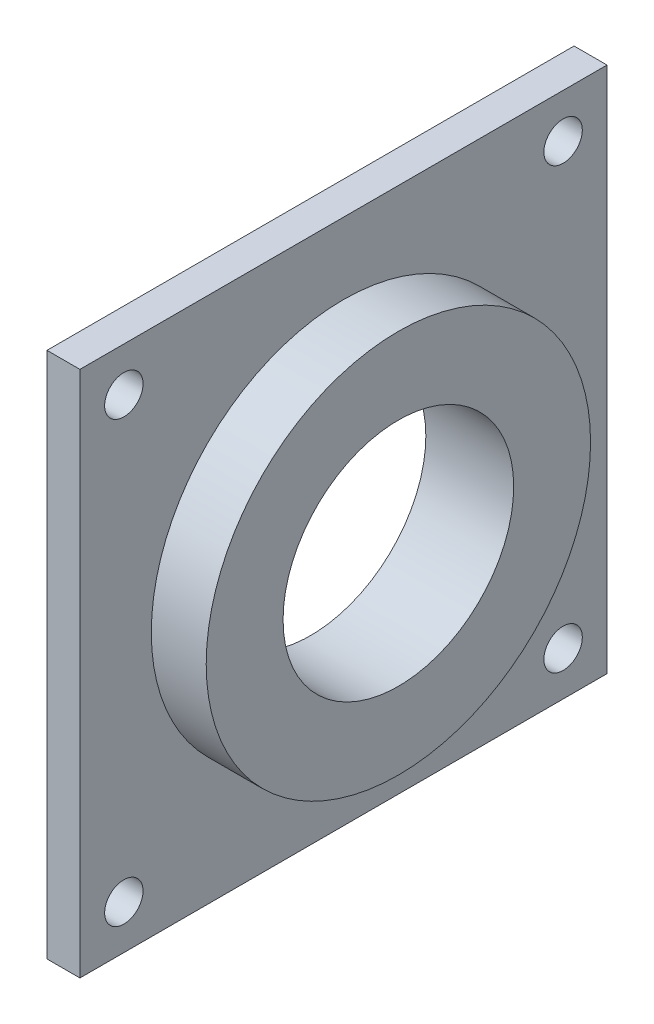
ISO-10303-21;
HEADER;
FILE_DESCRIPTION(('STEP AP214'),'2;1');
FILE_NAME('part.step','',(''),(''),'','','');
FILE_SCHEMA(('AUTOMOTIVE_DESIGN { 1 0 10303 214 1 1 1 1 }'));
ENDSEC;
DATA;
#1=APPLICATION_CONTEXT('core data for automotive mechanical design processes');
#2=APPLICATION_PROTOCOL_DEFINITION('international standard','automotive_design',2000,#1);
#3=PRODUCT_CONTEXT('',#1,'mechanical');
#4=PRODUCT('Part','Part','',(#3));
#5=PRODUCT_RELATED_PRODUCT_CATEGORY('part','',(#4));
#6=PRODUCT_DEFINITION_FORMATION('','',#4);
#7=PRODUCT_DEFINITION_CONTEXT('part definition',#1,'design');
#8=PRODUCT_DEFINITION('design','',#6,#7);
#9=PRODUCT_DEFINITION_SHAPE('','',#8);
#10=(LENGTH_UNIT() NAMED_UNIT(*) SI_UNIT(.MILLI.,.METRE.));
#11=(NAMED_UNIT(*) PLANE_ANGLE_UNIT() SI_UNIT($,.RADIAN.));
#12=(NAMED_UNIT(*) SI_UNIT($,.STERADIAN.) SOLID_ANGLE_UNIT());
#13=UNCERTAINTY_MEASURE_WITH_UNIT(LENGTH_MEASURE(1.E-05),#10,'distance_accuracy_value','');
#14=(GEOMETRIC_REPRESENTATION_CONTEXT(3) GLOBAL_UNCERTAINTY_ASSIGNED_CONTEXT((#13)) GLOBAL_UNIT_ASSIGNED_CONTEXT((#10,
#11,#12)) REPRESENTATION_CONTEXT('',''));
#15=CARTESIAN_POINT('',(0.,0.,0.));
#16=DIRECTION('',(0.,0.,1.));
#17=DIRECTION('',(1.,0.,0.));
#18=AXIS2_PLACEMENT_3D('',#15,#16,#17);
#19=CARTESIAN_POINT('',(3.0073,24.,24.));
#20=DIRECTION('',(1.,0.,0.));
#21=DIRECTION('',(0.,0.,-1.));
#22=AXIS2_PLACEMENT_3D('',#19,#20,#21);
#23=CYLINDRICAL_SURFACE('',#22,17.5);
#24=CARTESIAN_POINT('',(3.0073,24.,24.));
#25=DIRECTION('',(1.,0.,0.));
#26=DIRECTION('',(0.,0.,-1.));
#27=AXIS2_PLACEMENT_3D('',#24,#25,#26);
#28=CIRCLE('',#27,17.5);
#29=CARTESIAN_POINT('',(3.0073,24.,6.5));
#30=VERTEX_POINT('',#29);
#31=EDGE_CURVE('E65',#30,#30,#28,.F.);
#32=ORIENTED_EDGE('',*,*,#31,.F.);
#33=EDGE_LOOP('',(#32));
#34=FACE_BOUND('',#33,.T.);
#35=CARTESIAN_POINT('',(8.0073,24.,24.));
#36=DIRECTION('',(1.,0.,0.));
#37=DIRECTION('',(0.,0.,-1.));
#38=AXIS2_PLACEMENT_3D('',#35,#36,#37);
#39=CIRCLE('',#38,17.5);
#40=CARTESIAN_POINT('',(8.0073,24.,6.5));
#41=VERTEX_POINT('',#40);
#42=EDGE_CURVE('E18',#41,#41,#39,.T.);
#43=ORIENTED_EDGE('',*,*,#42,.F.);
#44=EDGE_LOOP('',(#43));
#45=FACE_BOUND('',#44,.T.);
#46=ADVANCED_FACE('F15',(#34,#45),#23,.T.);
#47=CARTESIAN_POINT('',(8.0073,24.,24.));
#48=DIRECTION('',(1.,0.,0.));
#49=DIRECTION('',(0.,0.,-1.));
#50=AXIS2_PLACEMENT_3D('',#47,#48,#49);
#51=PLANE('',#50);
#52=CARTESIAN_POINT('',(8.0073,24.,24.));
#53=DIRECTION('',(1.,0.,0.));
#54=DIRECTION('',(0.,0.,-1.));
#55=AXIS2_PLACEMENT_3D('',#52,#53,#54);
#56=CIRCLE('',#55,10.5);
#57=CARTESIAN_POINT('',(8.0073,24.,13.5));
#58=VERTEX_POINT('',#57);
#59=EDGE_CURVE('E95',#58,#58,#56,.F.);
#60=ORIENTED_EDGE('',*,*,#59,.T.);
#61=EDGE_LOOP('',(#60));
#62=FACE_BOUND('',#61,.T.);
#63=ORIENTED_EDGE('',*,*,#42,.T.);
#64=EDGE_LOOP('',(#63));
#65=FACE_BOUND('',#64,.T.);
#66=ADVANCED_FACE('F112',(#62,#65),#51,.T.);
#67=CARTESIAN_POINT('',(3.0073,0.,0.));
#68=DIRECTION('',(1.,0.,0.));
#69=DIRECTION('',(0.,0.,-1.));
#70=AXIS2_PLACEMENT_3D('',#67,#68,#69);
#71=PLANE('',#70);
#72=CARTESIAN_POINT('',(3.0073,4.,44.));
#73=DIRECTION('',(1.,0.,0.));
#74=DIRECTION('',(0.,0.,-1.));
#75=AXIS2_PLACEMENT_3D('',#72,#73,#74);
#76=CIRCLE('',#75,1.75);
#77=CARTESIAN_POINT('',(3.0073,4.,42.25));
#78=VERTEX_POINT('',#77);
#79=EDGE_CURVE('E92',#78,#78,#76,.F.);
#80=ORIENTED_EDGE('',*,*,#79,.T.);
#81=EDGE_LOOP('',(#80));
#82=FACE_BOUND('',#81,.T.);
#83=ORIENTED_EDGE('',*,*,#31,.T.);
#84=EDGE_LOOP('',(#83));
#85=FACE_BOUND('',#84,.T.);
#86=CARTESIAN_POINT('',(3.0073,4.,4.));
#87=DIRECTION('',(1.,0.,0.));
#88=DIRECTION('',(0.,0.,-1.));
#89=AXIS2_PLACEMENT_3D('',#86,#87,#88);
#90=CIRCLE('',#89,1.75);
#91=CARTESIAN_POINT('',(3.0073,4.,2.25));
#92=VERTEX_POINT('',#91);
#93=EDGE_CURVE('E98',#92,#92,#90,.F.);
#94=ORIENTED_EDGE('',*,*,#93,.T.);
#95=EDGE_LOOP('',(#94));
#96=FACE_BOUND('',#95,.T.);
#97=CARTESIAN_POINT('',(3.0073,44.,44.));
#98=DIRECTION('',(1.,0.,0.));
#99=DIRECTION('',(0.,0.,-1.));
#100=AXIS2_PLACEMENT_3D('',#97,#98,#99);
#101=CIRCLE('',#100,1.75);
#102=CARTESIAN_POINT('',(3.0073,44.,42.25));
#103=VERTEX_POINT('',#102);
#104=EDGE_CURVE('E101',#103,#103,#101,.F.);
#105=ORIENTED_EDGE('',*,*,#104,.T.);
#106=EDGE_LOOP('',(#105));
#107=FACE_BOUND('',#106,.T.);
#108=CARTESIAN_POINT('',(3.0073,44.,4.));
#109=DIRECTION('',(1.,0.,0.));
#110=DIRECTION('',(0.,0.,-1.));
#111=AXIS2_PLACEMENT_3D('',#108,#109,#110);
#112=CIRCLE('',#111,1.75);
#113=CARTESIAN_POINT('',(3.0073,44.,2.25));
#114=VERTEX_POINT('',#113);
#115=EDGE_CURVE('E104',#114,#114,#112,.F.);
#116=ORIENTED_EDGE('',*,*,#115,.T.);
#117=EDGE_LOOP('',(#116));
#118=FACE_BOUND('',#117,.T.);
#119=DIRECTION('',(0.,0.,1.));
#120=VECTOR('',#119,1.);
#121=CARTESIAN_POINT('',(3.0073,48.,0.));
#122=LINE('',#121,#120);
#123=CARTESIAN_POINT('',(3.0073,48.,48.));
#124=VERTEX_POINT('',#123);
#125=CARTESIAN_POINT('',(3.0073,48.,0.));
#126=VERTEX_POINT('',#125);
#127=EDGE_CURVE('E256',#124,#126,#122,.F.);
#128=ORIENTED_EDGE('',*,*,#127,.F.);
#129=DIRECTION('',(0.,1.,0.));
#130=VECTOR('',#129,1.);
#131=CARTESIAN_POINT('',(3.0073,0.,48.));
#132=LINE('',#131,#130);
#133=CARTESIAN_POINT('',(3.0073,0.,48.));
#134=VERTEX_POINT('',#133);
#135=EDGE_CURVE('E59',#134,#124,#132,.T.);
#136=ORIENTED_EDGE('',*,*,#135,.F.);
#137=DIRECTION('',(0.,0.,1.));
#138=VECTOR('',#137,1.);
#139=CARTESIAN_POINT('',(3.0073,0.,0.));
#140=LINE('',#139,#138);
#141=CARTESIAN_POINT('',(3.0073,0.,0.));
#142=VERTEX_POINT('',#141);
#143=EDGE_CURVE('E57',#134,#142,#140,.F.);
#144=ORIENTED_EDGE('',*,*,#143,.T.);
#145=DIRECTION('',(0.,1.,0.));
#146=VECTOR('',#145,1.);
#147=CARTESIAN_POINT('',(3.0073,0.,0.));
#148=LINE('',#147,#146);
#149=EDGE_CURVE('E54',#142,#126,#148,.T.);
#150=ORIENTED_EDGE('',*,*,#149,.T.);
#151=EDGE_LOOP('',(#128,#136,#144,#150));
#152=FACE_BOUND('',#151,.T.);
#153=ADVANCED_FACE('F58',(#82,#85,#96,#107,#118,#152),#71,.T.);
#154=CARTESIAN_POINT('',(0.007300000000001,0.,0.));
#155=DIRECTION('',(0.,1.,0.));
#156=DIRECTION('',(0.,0.,1.));
#157=AXIS2_PLACEMENT_3D('',#154,#155,#156);
#158=PLANE('',#157);
#159=DIRECTION('',(1.,0.,0.));
#160=VECTOR('',#159,1.);
#161=CARTESIAN_POINT('',(0.007300000000001,0.,48.));
#162=LINE('',#161,#160);
#163=CARTESIAN_POINT('',(0.007300000000001,0.,48.));
#164=VERTEX_POINT('',#163);
#165=EDGE_CURVE('E260',#164,#134,#162,.T.);
#166=ORIENTED_EDGE('',*,*,#165,.F.);
#167=DIRECTION('',(0.,0.,-1.));
#168=VECTOR('',#167,1.);
#169=CARTESIAN_POINT('',(0.007300000000001,0.,0.));
#170=LINE('',#169,#168);
#171=CARTESIAN_POINT('',(0.007300000000001,0.,0.));
#172=VERTEX_POINT('',#171);
#173=EDGE_CURVE('E76',#164,#172,#170,.T.);
#174=ORIENTED_EDGE('',*,*,#173,.T.);
#175=DIRECTION('',(1.,0.,0.));
#176=VECTOR('',#175,1.);
#177=CARTESIAN_POINT('',(0.007300000000001,0.,0.));
#178=LINE('',#177,#176);
#179=EDGE_CURVE('E64',#172,#142,#178,.T.);
#180=ORIENTED_EDGE('',*,*,#179,.T.);
#181=ORIENTED_EDGE('',*,*,#143,.F.);
#182=EDGE_LOOP('',(#166,#174,#180,#181));
#183=FACE_BOUND('',#182,.T.);
#184=ADVANCED_FACE('F75',(#183),#158,.F.);
#185=CARTESIAN_POINT('',(0.007300000000001,0.,0.));
#186=DIRECTION('',(0.,0.,1.));
#187=DIRECTION('',(1.,0.,0.));
#188=AXIS2_PLACEMENT_3D('',#185,#186,#187);
#189=PLANE('',#188);
#190=ORIENTED_EDGE('',*,*,#149,.F.);
#191=ORIENTED_EDGE('',*,*,#179,.F.);
#192=DIRECTION('',(0.,1.,0.));
#193=VECTOR('',#192,1.);
#194=CARTESIAN_POINT('',(0.007300000000001,0.,0.));
#195=LINE('',#194,#193);
#196=CARTESIAN_POINT('',(0.007300000000001,48.,0.));
#197=VERTEX_POINT('',#196);
#198=EDGE_CURVE('E267',#172,#197,#195,.T.);
#199=ORIENTED_EDGE('',*,*,#198,.T.);
#200=DIRECTION('',(1.,0.,0.));
#201=VECTOR('',#200,1.);
#202=CARTESIAN_POINT('',(0.007300000000001,48.,0.));
#203=LINE('',#202,#201);
#204=EDGE_CURVE('E72',#126,#197,#203,.F.);
#205=ORIENTED_EDGE('',*,*,#204,.F.);
#206=EDGE_LOOP('',(#190,#191,#199,#205));
#207=FACE_BOUND('',#206,.T.);
#208=ADVANCED_FACE('F69',(#207),#189,.F.);
#209=CARTESIAN_POINT('',(0.007300000000001,48.,0.));
#210=DIRECTION('',(0.,1.,0.));
#211=DIRECTION('',(0.,0.,1.));
#212=AXIS2_PLACEMENT_3D('',#209,#210,#211);
#213=PLANE('',#212);
#214=DIRECTION('',(1.,0.,0.));
#215=VECTOR('',#214,1.);
#216=CARTESIAN_POINT('',(0.007300000000001,48.,48.));
#217=LINE('',#216,#215);
#218=CARTESIAN_POINT('',(0.007300000000001,48.,48.));
#219=VERTEX_POINT('',#218);
#220=EDGE_CURVE('E33',#124,#219,#217,.F.);
#221=ORIENTED_EDGE('',*,*,#220,.F.);
#222=ORIENTED_EDGE('',*,*,#127,.T.);
#223=ORIENTED_EDGE('',*,*,#204,.T.);
#224=DIRECTION('',(0.,0.,-1.));
#225=VECTOR('',#224,1.);
#226=CARTESIAN_POINT('',(0.007300000000001,48.,0.));
#227=LINE('',#226,#225);
#228=EDGE_CURVE('E258',#197,#219,#227,.F.);
#229=ORIENTED_EDGE('',*,*,#228,.T.);
#230=EDGE_LOOP('',(#221,#222,#223,#229));
#231=FACE_BOUND('',#230,.T.);
#232=ADVANCED_FACE('F153',(#231),#213,.T.);
#233=CARTESIAN_POINT('',(0.007300000000001,0.,48.));
#234=DIRECTION('',(0.,0.,1.));
#235=DIRECTION('',(1.,0.,0.));
#236=AXIS2_PLACEMENT_3D('',#233,#234,#235);
#237=PLANE('',#236);
#238=ORIENTED_EDGE('',*,*,#135,.T.);
#239=ORIENTED_EDGE('',*,*,#220,.T.);
#240=DIRECTION('',(0.,1.,0.));
#241=VECTOR('',#240,1.);
#242=CARTESIAN_POINT('',(0.007300000000001,0.,48.));
#243=LINE('',#242,#241);
#244=EDGE_CURVE('E91',#219,#164,#243,.F.);
#245=ORIENTED_EDGE('',*,*,#244,.T.);
#246=ORIENTED_EDGE('',*,*,#165,.T.);
#247=EDGE_LOOP('',(#238,#239,#245,#246));
#248=FACE_BOUND('',#247,.T.);
#249=ADVANCED_FACE('F149',(#248),#237,.T.);
#250=CARTESIAN_POINT('',(0.007300000000001,44.,4.));
#251=DIRECTION('',(1.,0.,0.));
#252=DIRECTION('',(0.,0.,-1.));
#253=AXIS2_PLACEMENT_3D('',#250,#251,#252);
#254=CYLINDRICAL_SURFACE('',#253,1.75);
#255=CARTESIAN_POINT('',(0.007300000000001,44.,4.));
#256=DIRECTION('',(1.,0.,0.));
#257=DIRECTION('',(0.,0.,-1.));
#258=AXIS2_PLACEMENT_3D('',#255,#256,#257);
#259=CIRCLE('',#258,1.75);
#260=CARTESIAN_POINT('',(0.007300000000001,44.,2.25));
#261=VERTEX_POINT('',#260);
#262=EDGE_CURVE('E88',#261,#261,#259,.F.);
#263=ORIENTED_EDGE('',*,*,#262,.T.);
#264=EDGE_LOOP('',(#263));
#265=FACE_BOUND('',#264,.T.);
#266=ORIENTED_EDGE('',*,*,#115,.F.);
#267=EDGE_LOOP('',(#266));
#268=FACE_BOUND('',#267,.T.);
#269=ADVANCED_FACE('F145',(#265,#268),#254,.F.);
#270=CARTESIAN_POINT('',(0.007300000000001,44.,44.));
#271=DIRECTION('',(1.,0.,0.));
#272=DIRECTION('',(0.,0.,-1.));
#273=AXIS2_PLACEMENT_3D('',#270,#271,#272);
#274=CYLINDRICAL_SURFACE('',#273,1.75);
#275=CARTESIAN_POINT('',(0.007300000000001,44.,44.));
#276=DIRECTION('',(1.,0.,0.));
#277=DIRECTION('',(0.,0.,-1.));
#278=AXIS2_PLACEMENT_3D('',#275,#276,#277);
#279=CIRCLE('',#278,1.75);
#280=CARTESIAN_POINT('',(0.007300000000001,44.,42.25));
#281=VERTEX_POINT('',#280);
#282=EDGE_CURVE('E85',#281,#281,#279,.F.);
#283=ORIENTED_EDGE('',*,*,#282,.T.);
#284=EDGE_LOOP('',(#283));
#285=FACE_BOUND('',#284,.T.);
#286=ORIENTED_EDGE('',*,*,#104,.F.);
#287=EDGE_LOOP('',(#286));
#288=FACE_BOUND('',#287,.T.);
#289=ADVANCED_FACE('F141',(#285,#288),#274,.F.);
#290=CARTESIAN_POINT('',(0.007300000000001,4.,4.));
#291=DIRECTION('',(1.,0.,0.));
#292=DIRECTION('',(0.,0.,-1.));
#293=AXIS2_PLACEMENT_3D('',#290,#291,#292);
#294=CYLINDRICAL_SURFACE('',#293,1.75);
#295=CARTESIAN_POINT('',(0.007300000000001,4.,4.));
#296=DIRECTION('',(1.,0.,0.));
#297=DIRECTION('',(0.,0.,-1.));
#298=AXIS2_PLACEMENT_3D('',#295,#296,#297);
#299=CIRCLE('',#298,1.75);
#300=CARTESIAN_POINT('',(0.007300000000001,4.,2.25));
#301=VERTEX_POINT('',#300);
#302=EDGE_CURVE('E82',#301,#301,#299,.F.);
#303=ORIENTED_EDGE('',*,*,#302,.T.);
#304=EDGE_LOOP('',(#303));
#305=FACE_BOUND('',#304,.T.);
#306=ORIENTED_EDGE('',*,*,#93,.F.);
#307=EDGE_LOOP('',(#306));
#308=FACE_BOUND('',#307,.T.);
#309=ADVANCED_FACE('F137',(#305,#308),#294,.F.);
#310=CARTESIAN_POINT('',(0.007300000000001,24.,24.));
#311=DIRECTION('',(1.,0.,0.));
#312=DIRECTION('',(0.,0.,-1.));
#313=AXIS2_PLACEMENT_3D('',#310,#311,#312);
#314=CYLINDRICAL_SURFACE('',#313,10.5);
#315=CARTESIAN_POINT('',(0.007300000000001,24.,24.));
#316=DIRECTION('',(1.,0.,0.));
#317=DIRECTION('',(0.,0.,-1.));
#318=AXIS2_PLACEMENT_3D('',#315,#316,#317);
#319=CIRCLE('',#318,10.5);
#320=CARTESIAN_POINT('',(0.007300000000001,24.,13.5));
#321=VERTEX_POINT('',#320);
#322=EDGE_CURVE('E24',#321,#321,#319,.F.);
#323=ORIENTED_EDGE('',*,*,#322,.T.);
#324=EDGE_LOOP('',(#323));
#325=FACE_BOUND('',#324,.T.);
#326=ORIENTED_EDGE('',*,*,#59,.F.);
#327=EDGE_LOOP('',(#326));
#328=FACE_BOUND('',#327,.T.);
#329=ADVANCED_FACE('F129',(#325,#328),#314,.F.);
#330=CARTESIAN_POINT('',(0.007300000000001,4.,44.));
#331=DIRECTION('',(1.,0.,0.));
#332=DIRECTION('',(0.,0.,-1.));
#333=AXIS2_PLACEMENT_3D('',#330,#331,#332);
#334=CYLINDRICAL_SURFACE('',#333,1.75);
#335=CARTESIAN_POINT('',(0.007300000000001,4.,44.));
#336=DIRECTION('',(1.,0.,0.));
#337=DIRECTION('',(0.,0.,-1.));
#338=AXIS2_PLACEMENT_3D('',#335,#336,#337);
#339=CIRCLE('',#338,1.75);
#340=CARTESIAN_POINT('',(0.007300000000001,4.,42.25));
#341=VERTEX_POINT('',#340);
#342=EDGE_CURVE('E9',#341,#341,#339,.F.);
#343=ORIENTED_EDGE('',*,*,#342,.T.);
#344=EDGE_LOOP('',(#343));
#345=FACE_BOUND('',#344,.T.);
#346=ORIENTED_EDGE('',*,*,#79,.F.);
#347=EDGE_LOOP('',(#346));
#348=FACE_BOUND('',#347,.T.);
#349=ADVANCED_FACE('F123',(#345,#348),#334,.F.);
#350=CARTESIAN_POINT('',(0.007300000000001,0.,0.));
#351=DIRECTION('',(1.,0.,0.));
#352=DIRECTION('',(0.,0.,-1.));
#353=AXIS2_PLACEMENT_3D('',#350,#351,#352);
#354=PLANE('',#353);
#355=ORIENTED_EDGE('',*,*,#342,.F.);
#356=EDGE_LOOP('',(#355));
#357=FACE_BOUND('',#356,.T.);
#358=ORIENTED_EDGE('',*,*,#322,.F.);
#359=EDGE_LOOP('',(#358));
#360=FACE_BOUND('',#359,.T.);
#361=ORIENTED_EDGE('',*,*,#302,.F.);
#362=EDGE_LOOP('',(#361));
#363=FACE_BOUND('',#362,.T.);
#364=ORIENTED_EDGE('',*,*,#282,.F.);
#365=EDGE_LOOP('',(#364));
#366=FACE_BOUND('',#365,.T.);
#367=ORIENTED_EDGE('',*,*,#262,.F.);
#368=EDGE_LOOP('',(#367));
#369=FACE_BOUND('',#368,.T.);
#370=ORIENTED_EDGE('',*,*,#228,.F.);
#371=ORIENTED_EDGE('',*,*,#198,.F.);
#372=ORIENTED_EDGE('',*,*,#173,.F.);
#373=ORIENTED_EDGE('',*,*,#244,.F.);
#374=EDGE_LOOP('',(#370,#371,#372,#373));
#375=FACE_BOUND('',#374,.T.);
#376=ADVANCED_FACE('F121',(#357,#360,#363,#366,#369,#375),#354,.F.);
#377=CLOSED_SHELL('',(#46,#66,#153,#184,#208,#232,#249,#269,#289,#309,#329,#349,#376));
#378=MANIFOLD_SOLID_BREP('B1',#377);
#379=ADVANCED_BREP_SHAPE_REPRESENTATION('',(#18,#378),#14);
#380=SHAPE_DEFINITION_REPRESENTATION(#9,#379);
ENDSEC;
END-ISO-10303-21;
